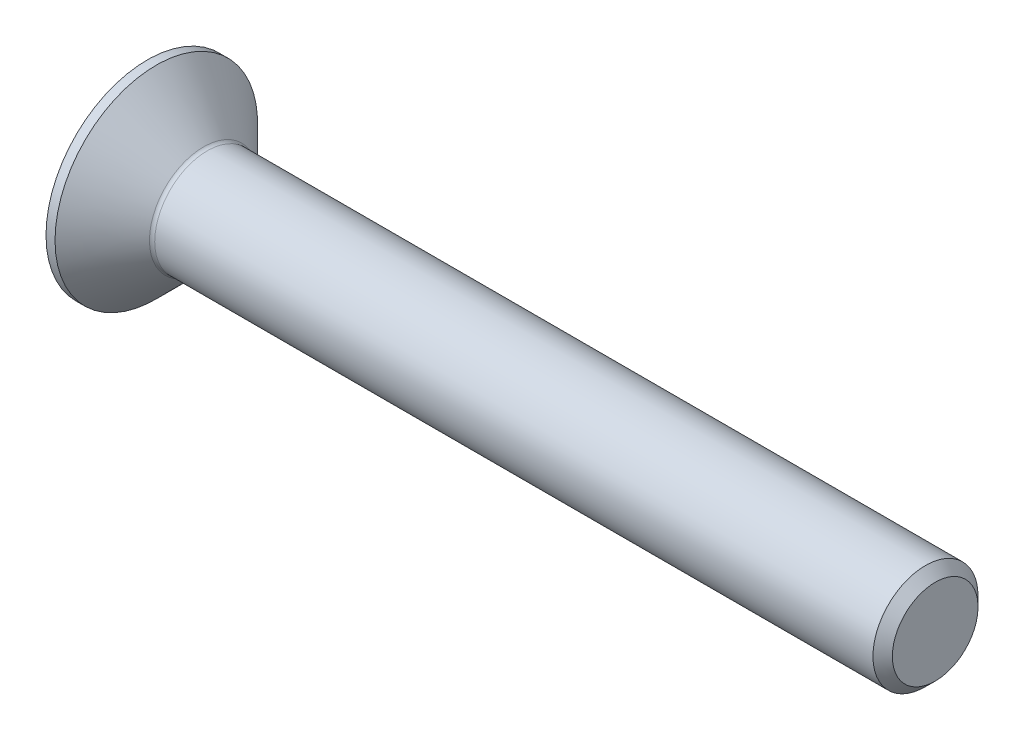
ISO-10303-21;
HEADER;
FILE_DESCRIPTION(('STEP AP214'),'2;1');
FILE_NAME('part.step','',(''),(''),'','','');
FILE_SCHEMA(('AUTOMOTIVE_DESIGN { 1 0 10303 214 1 1 1 1 }'));
ENDSEC;
DATA;
#1=APPLICATION_CONTEXT('core data for automotive mechanical design processes');
#2=APPLICATION_PROTOCOL_DEFINITION('international standard','automotive_design',2000,#1);
#3=PRODUCT_CONTEXT('',#1,'mechanical');
#4=PRODUCT('Part','Part','',(#3));
#5=PRODUCT_RELATED_PRODUCT_CATEGORY('part','',(#4));
#6=PRODUCT_DEFINITION_FORMATION('','',#4);
#7=PRODUCT_DEFINITION_CONTEXT('part definition',#1,'design');
#8=PRODUCT_DEFINITION('design','',#6,#7);
#9=PRODUCT_DEFINITION_SHAPE('','',#8);
#10=(LENGTH_UNIT() NAMED_UNIT(*) SI_UNIT(.MILLI.,.METRE.));
#11=(NAMED_UNIT(*) PLANE_ANGLE_UNIT() SI_UNIT($,.RADIAN.));
#12=(NAMED_UNIT(*) SI_UNIT($,.STERADIAN.) SOLID_ANGLE_UNIT());
#13=UNCERTAINTY_MEASURE_WITH_UNIT(LENGTH_MEASURE(1.E-05),#10,'distance_accuracy_value','');
#14=(GEOMETRIC_REPRESENTATION_CONTEXT(3) GLOBAL_UNCERTAINTY_ASSIGNED_CONTEXT((#13)) GLOBAL_UNIT_ASSIGNED_CONTEXT((#10,
#11,#12)) REPRESENTATION_CONTEXT('',''));
#15=CARTESIAN_POINT('',(0.,0.,0.));
#16=DIRECTION('',(0.,0.,1.));
#17=DIRECTION('',(1.,0.,0.));
#18=AXIS2_PLACEMENT_3D('',#15,#16,#17);
#19=CARTESIAN_POINT('',(0.,0.,0.));
#20=DIRECTION('',(-1.,0.,0.));
#21=DIRECTION('',(0.,0.,1.));
#22=AXIS2_PLACEMENT_3D('',#19,#20,#21);
#23=PLANE('',#22);
#24=CARTESIAN_POINT('',(0.,0.,0.));
#25=DIRECTION('',(-1.,0.,0.));
#26=DIRECTION('',(0.,0.,1.));
#27=AXIS2_PLACEMENT_3D('',#24,#25,#26);
#28=CIRCLE('',#27,5.785);
#29=CARTESIAN_POINT('',(0.,0.,5.785));
#30=VERTEX_POINT('',#29);
#31=EDGE_CURVE('E178',#30,#30,#28,.T.);
#32=ORIENTED_EDGE('',*,*,#31,.T.);
#33=EDGE_LOOP('',(#32));
#34=FACE_BOUND('',#33,.T.);
#35=DIRECTION('',(0.,-0.5,-0.866025403784439));
#36=VECTOR('',#35,1.);
#37=CARTESIAN_POINT('',(0.,-1.16047404107115,2.01));
#38=LINE('',#37,#36);
#39=CARTESIAN_POINT('',(0.,-1.16047404107115,2.01));
#40=VERTEX_POINT('',#39);
#41=CARTESIAN_POINT('',(0.,-2.32094808214229,0.));
#42=VERTEX_POINT('',#41);
#43=EDGE_CURVE('E135',#40,#42,#38,.T.);
#44=ORIENTED_EDGE('',*,*,#43,.T.);
#45=DIRECTION('',(0.,0.5,-0.866025403784439));
#46=VECTOR('',#45,1.);
#47=CARTESIAN_POINT('',(0.,-2.32094808214229,0.));
#48=LINE('',#47,#46);
#49=CARTESIAN_POINT('',(0.,-1.16047404107115,-2.01));
#50=VERTEX_POINT('',#49);
#51=EDGE_CURVE('E65',#42,#50,#48,.T.);
#52=ORIENTED_EDGE('',*,*,#51,.T.);
#53=DIRECTION('',(0.,1.,0.));
#54=VECTOR('',#53,1.);
#55=CARTESIAN_POINT('',(0.,-1.16047404107115,-2.01));
#56=LINE('',#55,#54);
#57=CARTESIAN_POINT('',(0.,1.16047404107115,-2.01));
#58=VERTEX_POINT('',#57);
#59=EDGE_CURVE('E147',#50,#58,#56,.T.);
#60=ORIENTED_EDGE('',*,*,#59,.T.);
#61=DIRECTION('',(0.,0.5,0.866025403784439));
#62=VECTOR('',#61,1.);
#63=CARTESIAN_POINT('',(0.,1.16047404107115,-2.01));
#64=LINE('',#63,#62);
#65=CARTESIAN_POINT('',(0.,2.3209480821423,0.));
#66=VERTEX_POINT('',#65);
#67=EDGE_CURVE('E292',#58,#66,#64,.T.);
#68=ORIENTED_EDGE('',*,*,#67,.T.);
#69=DIRECTION('',(0.,-0.5,0.866025403784438));
#70=VECTOR('',#69,1.);
#71=CARTESIAN_POINT('',(0.,2.3209480821423,0.));
#72=LINE('',#71,#70);
#73=CARTESIAN_POINT('',(0.,1.16047404107115,2.01));
#74=VERTEX_POINT('',#73);
#75=EDGE_CURVE('E296',#66,#74,#72,.T.);
#76=ORIENTED_EDGE('',*,*,#75,.T.);
#77=DIRECTION('',(0.,-1.,0.));
#78=VECTOR('',#77,1.);
#79=CARTESIAN_POINT('',(0.,1.16047404107115,2.01));
#80=LINE('',#79,#78);
#81=EDGE_CURVE('E300',#74,#40,#80,.T.);
#82=ORIENTED_EDGE('',*,*,#81,.T.);
#83=EDGE_LOOP('',(#44,#52,#60,#68,#76,#82));
#84=FACE_BOUND('',#83,.T.);
#85=ADVANCED_FACE('F49',(#34,#84),#23,.T.);
#86=CARTESIAN_POINT('',(0.,0.,0.));
#87=DIRECTION('',(-1.,0.,0.));
#88=DIRECTION('',(0.,0.,1.));
#89=AXIS2_PLACEMENT_3D('',#86,#87,#88);
#90=CYLINDRICAL_SURFACE('',#89,5.785);
#91=CARTESIAN_POINT('',(0.515000000000011,0.,0.));
#92=DIRECTION('',(-1.,0.,0.));
#93=DIRECTION('',(0.,0.,1.));
#94=AXIS2_PLACEMENT_3D('',#91,#92,#93);
#95=CIRCLE('',#94,5.785);
#96=CARTESIAN_POINT('',(0.515000000000011,0.,5.785));
#97=VERTEX_POINT('',#96);
#98=EDGE_CURVE('E174',#97,#97,#95,.T.);
#99=ORIENTED_EDGE('',*,*,#98,.T.);
#100=EDGE_LOOP('',(#99));
#101=FACE_BOUND('',#100,.T.);
#102=ORIENTED_EDGE('',*,*,#31,.F.);
#103=EDGE_LOOP('',(#102));
#104=FACE_BOUND('',#103,.T.);
#105=ADVANCED_FACE('F203',(#101,#104),#90,.T.);
#106=CARTESIAN_POINT('',(0.515000000000011,0.,0.));
#107=DIRECTION('',(-1.,0.,0.));
#108=DIRECTION('',(0.,0.,1.));
#109=AXIS2_PLACEMENT_3D('',#106,#107,#108);
#110=CONICAL_SURFACE('',#109,5.785,0.78539816339745);
#111=CARTESIAN_POINT('',(3.21213203435596,0.,0.));
#112=DIRECTION('',(-1.,0.,0.));
#113=DIRECTION('',(0.,0.,1.));
#114=AXIS2_PLACEMENT_3D('',#111,#112,#113);
#115=CIRCLE('',#114,3.08786796564404);
#116=CARTESIAN_POINT('',(3.21213203435596,0.,3.08786796564404));
#117=VERTEX_POINT('',#116);
#118=EDGE_CURVE('E58',#117,#117,#115,.T.);
#119=ORIENTED_EDGE('',*,*,#118,.T.);
#120=EDGE_LOOP('',(#119));
#121=FACE_BOUND('',#120,.T.);
#122=ORIENTED_EDGE('',*,*,#98,.F.);
#123=EDGE_LOOP('',(#122));
#124=FACE_BOUND('',#123,.T.);
#125=ADVANCED_FACE('F186',(#121,#124),#110,.T.);
#126=CARTESIAN_POINT('',(0.,0.,0.));
#127=DIRECTION('',(-1.,0.,0.));
#128=DIRECTION('',(0.,0.,1.));
#129=AXIS2_PLACEMENT_3D('',#126,#127,#128);
#130=CYLINDRICAL_SURFACE('',#129,3.);
#131=CARTESIAN_POINT('',(3.42426406871193,0.,0.));
#132=DIRECTION('',(-1.,0.,0.));
#133=DIRECTION('',(0.,0.,1.));
#134=AXIS2_PLACEMENT_3D('',#131,#132,#133);
#135=CIRCLE('',#134,3.);
#136=CARTESIAN_POINT('',(3.42426406871193,0.,3.));
#137=VERTEX_POINT('',#136);
#138=EDGE_CURVE('E11',#137,#137,#135,.F.);
#139=ORIENTED_EDGE('',*,*,#138,.T.);
#140=EDGE_LOOP('',(#139));
#141=FACE_BOUND('',#140,.T.);
#142=CARTESIAN_POINT('',(44.4455,0.,0.));
#143=DIRECTION('',(-1.,0.,0.));
#144=DIRECTION('',(0.,0.,1.));
#145=AXIS2_PLACEMENT_3D('',#142,#143,#144);
#146=CIRCLE('',#145,3.);
#147=CARTESIAN_POINT('',(44.4455,0.,3.));
#148=VERTEX_POINT('',#147);
#149=EDGE_CURVE('E170',#148,#148,#146,.T.);
#150=ORIENTED_EDGE('',*,*,#149,.T.);
#151=EDGE_LOOP('',(#150));
#152=FACE_BOUND('',#151,.T.);
#153=ADVANCED_FACE('F214',(#141,#152),#130,.T.);
#154=CARTESIAN_POINT('',(45.,0.,0.));
#155=DIRECTION('',(-1.,0.,0.));
#156=DIRECTION('',(0.,0.,1.));
#157=AXIS2_PLACEMENT_3D('',#154,#155,#156);
#158=CONICAL_SURFACE('',#157,2.4455,0.785398163397462);
#159=ORIENTED_EDGE('',*,*,#149,.F.);
#160=EDGE_LOOP('',(#159));
#161=FACE_BOUND('',#160,.T.);
#162=CARTESIAN_POINT('',(45.,0.,0.));
#163=DIRECTION('',(-1.,0.,0.));
#164=DIRECTION('',(0.,0.,1.));
#165=AXIS2_PLACEMENT_3D('',#162,#163,#164);
#166=CIRCLE('',#165,2.4455);
#167=CARTESIAN_POINT('',(45.,0.,2.4455));
#168=VERTEX_POINT('',#167);
#169=EDGE_CURVE('E165',#168,#168,#166,.T.);
#170=ORIENTED_EDGE('',*,*,#169,.T.);
#171=EDGE_LOOP('',(#170));
#172=FACE_BOUND('',#171,.T.);
#173=ADVANCED_FACE('F199',(#161,#172),#158,.T.);
#174=CARTESIAN_POINT('',(45.,2.4455,0.));
#175=DIRECTION('',(1.,0.,0.));
#176=DIRECTION('',(0.,0.,-1.));
#177=AXIS2_PLACEMENT_3D('',#174,#175,#176);
#178=PLANE('',#177);
#179=ORIENTED_EDGE('',*,*,#169,.F.);
#180=EDGE_LOOP('',(#179));
#181=FACE_BOUND('',#180,.T.);
#182=ADVANCED_FACE('F190',(#181),#178,.T.);
#183=CARTESIAN_POINT('',(3.42426406871193,0.,0.));
#184=DIRECTION('',(-1.,0.,0.));
#185=DIRECTION('',(0.,0.,1.));
#186=AXIS2_PLACEMENT_3D('',#183,#184,#185);
#187=TOROIDAL_SURFACE('',#186,3.3,0.3);
#188=ORIENTED_EDGE('',*,*,#138,.F.);
#189=EDGE_LOOP('',(#188));
#190=FACE_BOUND('',#189,.T.);
#191=ORIENTED_EDGE('',*,*,#118,.F.);
#192=EDGE_LOOP('',(#191));
#193=FACE_BOUND('',#192,.T.);
#194=ADVANCED_FACE('F51',(#190,#193),#187,.F.);
#195=CARTESIAN_POINT('',(2.5,-2.32094808214229,0.));
#196=DIRECTION('',(0.,0.866025403784439,0.5));
#197=DIRECTION('',(0.,-0.5,0.866025403784439));
#198=AXIS2_PLACEMENT_3D('',#195,#196,#197);
#199=PLANE('',#198);
#200=ORIENTED_EDGE('',*,*,#51,.F.);
#201=DIRECTION('',(-1.,0.,0.));
#202=VECTOR('',#201,1.);
#203=CARTESIAN_POINT('',(2.5,-2.32094808214229,0.));
#204=LINE('',#203,#202);
#205=CARTESIAN_POINT('',(2.5,-2.32094808214229,0.));
#206=VERTEX_POINT('',#205);
#207=EDGE_CURVE('E287',#206,#42,#204,.T.);
#208=ORIENTED_EDGE('',*,*,#207,.F.);
#209=DIRECTION('',(0.,0.5,-0.866025403784439));
#210=VECTOR('',#209,1.);
#211=CARTESIAN_POINT('',(2.5,-2.32094808214229,0.));
#212=LINE('',#211,#210);
#213=CARTESIAN_POINT('',(2.5,-1.74071106160672,-1.005));
#214=VERTEX_POINT('',#213);
#215=EDGE_CURVE('E130',#206,#214,#212,.T.);
#216=ORIENTED_EDGE('',*,*,#215,.T.);
#217=CARTESIAN_POINT('',(2.5,-1.16047404107115,-2.01));
#218=VERTEX_POINT('',#217);
#219=EDGE_CURVE('E126',#214,#218,#212,.T.);
#220=ORIENTED_EDGE('',*,*,#219,.T.);
#221=DIRECTION('',(-1.,0.,0.));
#222=VECTOR('',#221,1.);
#223=CARTESIAN_POINT('',(2.5,-1.16047404107115,-2.01));
#224=LINE('',#223,#222);
#225=EDGE_CURVE('E128',#218,#50,#224,.T.);
#226=ORIENTED_EDGE('',*,*,#225,.T.);
#227=EDGE_LOOP('',(#200,#208,#216,#220,#226));
#228=FACE_BOUND('',#227,.T.);
#229=ADVANCED_FACE('F127',(#228),#199,.T.);
#230=CARTESIAN_POINT('',(2.5,-1.16047404107115,-2.01));
#231=DIRECTION('',(0.,0.,1.));
#232=DIRECTION('',(1.,0.,0.));
#233=AXIS2_PLACEMENT_3D('',#230,#231,#232);
#234=PLANE('',#233);
#235=ORIENTED_EDGE('',*,*,#59,.F.);
#236=ORIENTED_EDGE('',*,*,#225,.F.);
#237=DIRECTION('',(0.,1.,0.));
#238=VECTOR('',#237,1.);
#239=CARTESIAN_POINT('',(2.5,-1.16047404107115,-2.01));
#240=LINE('',#239,#238);
#241=CARTESIAN_POINT('',(2.5,0.,-2.01));
#242=VERTEX_POINT('',#241);
#243=EDGE_CURVE('E73',#218,#242,#240,.T.);
#244=ORIENTED_EDGE('',*,*,#243,.T.);
#245=CARTESIAN_POINT('',(2.5,1.16047404107115,-2.01));
#246=VERTEX_POINT('',#245);
#247=EDGE_CURVE('E142',#242,#246,#240,.T.);
#248=ORIENTED_EDGE('',*,*,#247,.T.);
#249=DIRECTION('',(-1.,0.,0.));
#250=VECTOR('',#249,1.);
#251=CARTESIAN_POINT('',(2.5,1.16047404107115,-2.01));
#252=LINE('',#251,#250);
#253=EDGE_CURVE('E150',#246,#58,#252,.T.);
#254=ORIENTED_EDGE('',*,*,#253,.T.);
#255=EDGE_LOOP('',(#235,#236,#244,#248,#254));
#256=FACE_BOUND('',#255,.T.);
#257=ADVANCED_FACE('F144',(#256),#234,.T.);
#258=CARTESIAN_POINT('',(2.5,1.16047404107115,-2.01));
#259=DIRECTION('',(0.,-0.866025403784439,0.5));
#260=DIRECTION('',(0.,-0.5,-0.866025403784439));
#261=AXIS2_PLACEMENT_3D('',#258,#259,#260);
#262=PLANE('',#261);
#263=ORIENTED_EDGE('',*,*,#67,.F.);
#264=ORIENTED_EDGE('',*,*,#253,.F.);
#265=DIRECTION('',(0.,0.5,0.866025403784439));
#266=VECTOR('',#265,1.);
#267=CARTESIAN_POINT('',(2.5,1.16047404107115,-2.01));
#268=LINE('',#267,#266);
#269=CARTESIAN_POINT('',(2.5,1.74071106160672,-1.005));
#270=VERTEX_POINT('',#269);
#271=EDGE_CURVE('E261',#246,#270,#268,.T.);
#272=ORIENTED_EDGE('',*,*,#271,.T.);
#273=CARTESIAN_POINT('',(2.5,2.3209480821423,0.));
#274=VERTEX_POINT('',#273);
#275=EDGE_CURVE('E141',#270,#274,#268,.T.);
#276=ORIENTED_EDGE('',*,*,#275,.T.);
#277=DIRECTION('',(-1.,0.,0.));
#278=VECTOR('',#277,1.);
#279=CARTESIAN_POINT('',(2.5,2.3209480821423,0.));
#280=LINE('',#279,#278);
#281=EDGE_CURVE('E159',#274,#66,#280,.T.);
#282=ORIENTED_EDGE('',*,*,#281,.T.);
#283=EDGE_LOOP('',(#263,#264,#272,#276,#282));
#284=FACE_BOUND('',#283,.T.);
#285=ADVANCED_FACE('F228',(#284),#262,.T.);
#286=CARTESIAN_POINT('',(2.5,2.3209480821423,0.));
#287=DIRECTION('',(0.,-0.866025403784439,-0.5));
#288=DIRECTION('',(0.,0.5,-0.866025403784439));
#289=AXIS2_PLACEMENT_3D('',#286,#287,#288);
#290=PLANE('',#289);
#291=ORIENTED_EDGE('',*,*,#75,.F.);
#292=ORIENTED_EDGE('',*,*,#281,.F.);
#293=DIRECTION('',(0.,-0.5,0.866025403784438));
#294=VECTOR('',#293,1.);
#295=CARTESIAN_POINT('',(2.5,2.3209480821423,0.));
#296=LINE('',#295,#294);
#297=CARTESIAN_POINT('',(2.5,1.74071106160672,1.005));
#298=VERTEX_POINT('',#297);
#299=EDGE_CURVE('E272',#274,#298,#296,.T.);
#300=ORIENTED_EDGE('',*,*,#299,.T.);
#301=CARTESIAN_POINT('',(2.5,1.16047404107115,2.01));
#302=VERTEX_POINT('',#301);
#303=EDGE_CURVE('E267',#298,#302,#296,.T.);
#304=ORIENTED_EDGE('',*,*,#303,.T.);
#305=DIRECTION('',(-1.,0.,0.));
#306=VECTOR('',#305,1.);
#307=CARTESIAN_POINT('',(2.5,1.16047404107115,2.01));
#308=LINE('',#307,#306);
#309=EDGE_CURVE('E313',#302,#74,#308,.T.);
#310=ORIENTED_EDGE('',*,*,#309,.T.);
#311=EDGE_LOOP('',(#291,#292,#300,#304,#310));
#312=FACE_BOUND('',#311,.T.);
#313=ADVANCED_FACE('F231',(#312),#290,.T.);
#314=CARTESIAN_POINT('',(2.5,1.16047404107115,2.01));
#315=DIRECTION('',(0.,0.,-1.));
#316=DIRECTION('',(-1.,0.,0.));
#317=AXIS2_PLACEMENT_3D('',#314,#315,#316);
#318=PLANE('',#317);
#319=ORIENTED_EDGE('',*,*,#81,.F.);
#320=ORIENTED_EDGE('',*,*,#309,.F.);
#321=DIRECTION('',(0.,-1.,0.));
#322=VECTOR('',#321,1.);
#323=CARTESIAN_POINT('',(2.5,1.16047404107115,2.01));
#324=LINE('',#323,#322);
#325=CARTESIAN_POINT('',(2.5,0.,2.01));
#326=VERTEX_POINT('',#325);
#327=EDGE_CURVE('E278',#302,#326,#324,.T.);
#328=ORIENTED_EDGE('',*,*,#327,.T.);
#329=CARTESIAN_POINT('',(2.5,-1.16047404107115,2.01));
#330=VERTEX_POINT('',#329);
#331=EDGE_CURVE('E277',#326,#330,#324,.T.);
#332=ORIENTED_EDGE('',*,*,#331,.T.);
#333=DIRECTION('',(-1.,0.,0.));
#334=VECTOR('',#333,1.);
#335=CARTESIAN_POINT('',(2.5,-1.16047404107115,2.01));
#336=LINE('',#335,#334);
#337=EDGE_CURVE('E309',#330,#40,#336,.T.);
#338=ORIENTED_EDGE('',*,*,#337,.T.);
#339=EDGE_LOOP('',(#319,#320,#328,#332,#338));
#340=FACE_BOUND('',#339,.T.);
#341=ADVANCED_FACE('F235',(#340),#318,.T.);
#342=CARTESIAN_POINT('',(2.5,-1.16047404107115,2.01));
#343=DIRECTION('',(0.,0.866025403784439,-0.5));
#344=DIRECTION('',(0.,0.5,0.866025403784439));
#345=AXIS2_PLACEMENT_3D('',#342,#343,#344);
#346=PLANE('',#345);
#347=ORIENTED_EDGE('',*,*,#43,.F.);
#348=ORIENTED_EDGE('',*,*,#337,.F.);
#349=DIRECTION('',(0.,-0.5,-0.866025403784439));
#350=VECTOR('',#349,1.);
#351=CARTESIAN_POINT('',(2.5,-1.16047404107115,2.01));
#352=LINE('',#351,#350);
#353=CARTESIAN_POINT('',(2.5,-1.74071106160672,1.005));
#354=VERTEX_POINT('',#353);
#355=EDGE_CURVE('E283',#330,#354,#352,.T.);
#356=ORIENTED_EDGE('',*,*,#355,.T.);
#357=EDGE_CURVE('E282',#354,#206,#352,.T.);
#358=ORIENTED_EDGE('',*,*,#357,.T.);
#359=ORIENTED_EDGE('',*,*,#207,.T.);
#360=EDGE_LOOP('',(#347,#348,#356,#358,#359));
#361=FACE_BOUND('',#360,.T.);
#362=ADVANCED_FACE('F239',(#361),#346,.T.);
#363=CARTESIAN_POINT('',(2.5,-1.16047404107115,-2.01));
#364=DIRECTION('',(1.,0.,0.));
#365=DIRECTION('',(0.,0.,-1.));
#366=AXIS2_PLACEMENT_3D('',#363,#364,#365);
#367=PLANE('',#366);
#368=ORIENTED_EDGE('',*,*,#243,.F.);
#369=ORIENTED_EDGE('',*,*,#219,.F.);
#370=CARTESIAN_POINT('',(2.5,0.,0.));
#371=DIRECTION('',(-1.,0.,0.));
#372=DIRECTION('',(0.,0.,1.));
#373=AXIS2_PLACEMENT_3D('',#370,#371,#372);
#374=CIRCLE('',#373,2.01);
#375=EDGE_CURVE('E138',#242,#214,#374,.T.);
#376=ORIENTED_EDGE('',*,*,#375,.F.);
#377=EDGE_LOOP('',(#368,#369,#376));
#378=FACE_BOUND('',#377,.T.);
#379=ADVANCED_FACE('F137',(#378),#367,.F.);
#380=ORIENTED_EDGE('',*,*,#215,.F.);
#381=ORIENTED_EDGE('',*,*,#357,.F.);
#382=EDGE_CURVE('E156',#214,#354,#374,.T.);
#383=ORIENTED_EDGE('',*,*,#382,.F.);
#384=EDGE_LOOP('',(#380,#381,#383));
#385=FACE_BOUND('',#384,.T.);
#386=ADVANCED_FACE('F245',(#385),#367,.F.);
#387=ORIENTED_EDGE('',*,*,#355,.F.);
#388=ORIENTED_EDGE('',*,*,#331,.F.);
#389=EDGE_CURVE('E149',#354,#326,#374,.T.);
#390=ORIENTED_EDGE('',*,*,#389,.F.);
#391=EDGE_LOOP('',(#387,#388,#390));
#392=FACE_BOUND('',#391,.T.);
#393=ADVANCED_FACE('F249',(#392),#367,.F.);
#394=ORIENTED_EDGE('',*,*,#327,.F.);
#395=ORIENTED_EDGE('',*,*,#303,.F.);
#396=EDGE_CURVE('E158',#326,#298,#374,.T.);
#397=ORIENTED_EDGE('',*,*,#396,.F.);
#398=EDGE_LOOP('',(#394,#395,#397));
#399=FACE_BOUND('',#398,.T.);
#400=ADVANCED_FACE('F257',(#399),#367,.F.);
#401=ORIENTED_EDGE('',*,*,#299,.F.);
#402=ORIENTED_EDGE('',*,*,#275,.F.);
#403=EDGE_CURVE('E166',#298,#270,#374,.T.);
#404=ORIENTED_EDGE('',*,*,#403,.F.);
#405=EDGE_LOOP('',(#401,#402,#404));
#406=FACE_BOUND('',#405,.T.);
#407=ADVANCED_FACE('F252',(#406),#367,.F.);
#408=ORIENTED_EDGE('',*,*,#271,.F.);
#409=ORIENTED_EDGE('',*,*,#247,.F.);
#410=EDGE_CURVE('E262',#270,#242,#374,.T.);
#411=ORIENTED_EDGE('',*,*,#410,.F.);
#412=EDGE_LOOP('',(#408,#409,#411));
#413=FACE_BOUND('',#412,.T.);
#414=ADVANCED_FACE('F223',(#413),#367,.F.);
#415=CARTESIAN_POINT('',(2.5,0.,0.));
#416=DIRECTION('',(-1.,0.,0.));
#417=DIRECTION('',(0.,0.,1.));
#418=AXIS2_PLACEMENT_3D('',#415,#416,#417);
#419=CONICAL_SURFACE('',#418,2.01,1.04719755119659);
#420=CARTESIAN_POINT('',(3.66047404107116,0.,0.));
#421=VERTEX_POINT('',#420);
#422=VERTEX_LOOP('',#421);
#423=FACE_BOUND('',#422,.T.);
#424=ORIENTED_EDGE('',*,*,#396,.T.);
#425=ORIENTED_EDGE('',*,*,#403,.T.);
#426=ORIENTED_EDGE('',*,*,#410,.T.);
#427=ORIENTED_EDGE('',*,*,#375,.T.);
#428=ORIENTED_EDGE('',*,*,#382,.T.);
#429=ORIENTED_EDGE('',*,*,#389,.T.);
#430=EDGE_LOOP('',(#424,#425,#426,#427,#428,#429));
#431=FACE_BOUND('',#430,.T.);
#432=ADVANCED_FACE('F221',(#423,#431),#419,.F.);
#433=CLOSED_SHELL('',(#85,#105,#125,#153,#173,#182,#194,#229,#257,#285,#313,#341,#362,#379,#386,
#393,#400,#407,#414,#432));
#434=MANIFOLD_SOLID_BREP('B2',#433);
#435=ADVANCED_BREP_SHAPE_REPRESENTATION('',(#18,#434),#14);
#436=SHAPE_DEFINITION_REPRESENTATION(#9,#435);
ENDSEC;
END-ISO-10303-21;
